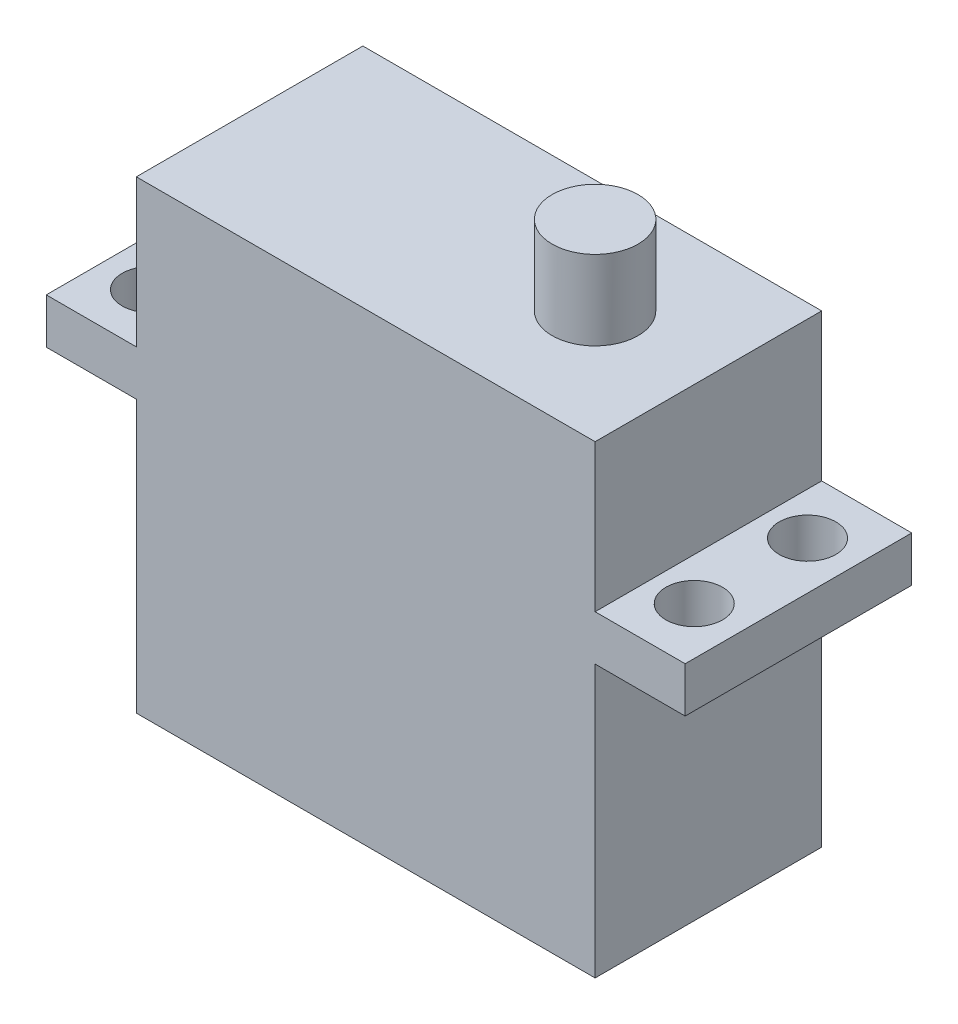
ISO-10303-21;
HEADER;
FILE_DESCRIPTION(('STEP AP214'),'2;1');
FILE_NAME('part.step','',(''),(''),'','','');
FILE_SCHEMA(('AUTOMOTIVE_DESIGN { 1 0 10303 214 1 1 1 1 }'));
ENDSEC;
DATA;
#1=APPLICATION_CONTEXT('core data for automotive mechanical design processes');
#2=APPLICATION_PROTOCOL_DEFINITION('international standard','automotive_design',2000,#1);
#3=PRODUCT_CONTEXT('',#1,'mechanical');
#4=PRODUCT('Part','Part','',(#3));
#5=PRODUCT_RELATED_PRODUCT_CATEGORY('part','',(#4));
#6=PRODUCT_DEFINITION_FORMATION('','',#4);
#7=PRODUCT_DEFINITION_CONTEXT('part definition',#1,'design');
#8=PRODUCT_DEFINITION('design','',#6,#7);
#9=PRODUCT_DEFINITION_SHAPE('','',#8);
#10=(LENGTH_UNIT() NAMED_UNIT(*) SI_UNIT(.MILLI.,.METRE.));
#11=(NAMED_UNIT(*) PLANE_ANGLE_UNIT() SI_UNIT($,.RADIAN.));
#12=(NAMED_UNIT(*) SI_UNIT($,.STERADIAN.) SOLID_ANGLE_UNIT());
#13=UNCERTAINTY_MEASURE_WITH_UNIT(LENGTH_MEASURE(1.E-05),#10,'distance_accuracy_value','');
#14=(GEOMETRIC_REPRESENTATION_CONTEXT(3) GLOBAL_UNCERTAINTY_ASSIGNED_CONTEXT((#13)) GLOBAL_UNIT_ASSIGNED_CONTEXT((#10,
#11,#12)) REPRESENTATION_CONTEXT('',''));
#15=CARTESIAN_POINT('',(0.,0.,0.));
#16=DIRECTION('',(0.,0.,1.));
#17=DIRECTION('',(1.,0.,0.));
#18=AXIS2_PLACEMENT_3D('',#15,#16,#17);
#19=CARTESIAN_POINT('',(-20.25,20.5,20.));
#20=DIRECTION('',(1.,0.,0.));
#21=DIRECTION('',(0.,0.,-1.));
#22=AXIS2_PLACEMENT_3D('',#19,#20,#21);
#23=PLANE('',#22);
#24=DIRECTION('',(0.,0.,-1.));
#25=VECTOR('',#24,1.);
#26=CARTESIAN_POINT('',(-20.25,7.5,0.));
#27=LINE('',#26,#25);
#28=CARTESIAN_POINT('',(-20.25,7.5,20.));
#29=VERTEX_POINT('',#28);
#30=CARTESIAN_POINT('',(-20.25,7.5,0.));
#31=VERTEX_POINT('',#30);
#32=EDGE_CURVE('E61',#29,#31,#27,.T.);
#33=ORIENTED_EDGE('',*,*,#32,.F.);
#34=DIRECTION('',(0.,-1.,0.));
#35=VECTOR('',#34,1.);
#36=CARTESIAN_POINT('',(-20.25,20.5,20.));
#37=LINE('',#36,#35);
#38=CARTESIAN_POINT('',(-20.25,20.5,20.));
#39=VERTEX_POINT('',#38);
#40=EDGE_CURVE('E216',#39,#29,#37,.T.);
#41=ORIENTED_EDGE('',*,*,#40,.F.);
#42=DIRECTION('',(0.,0.,-1.));
#43=VECTOR('',#42,1.);
#44=CARTESIAN_POINT('',(-20.25,20.5,20.));
#45=LINE('',#44,#43);
#46=CARTESIAN_POINT('',(-20.25,20.5,0.));
#47=VERTEX_POINT('',#46);
#48=EDGE_CURVE('E242',#39,#47,#45,.T.);
#49=ORIENTED_EDGE('',*,*,#48,.T.);
#50=DIRECTION('',(0.,-1.,0.));
#51=VECTOR('',#50,1.);
#52=CARTESIAN_POINT('',(-20.25,20.5,0.));
#53=LINE('',#52,#51);
#54=EDGE_CURVE('E229',#47,#31,#53,.T.);
#55=ORIENTED_EDGE('',*,*,#54,.T.);
#56=EDGE_LOOP('',(#33,#41,#49,#55));
#57=FACE_BOUND('',#56,.T.);
#58=ADVANCED_FACE('F45',(#57),#23,.F.);
#59=DIRECTION('',(0.,0.,1.));
#60=VECTOR('',#59,1.);
#61=CARTESIAN_POINT('',(-20.25,3.5,0.));
#62=LINE('',#61,#60);
#63=CARTESIAN_POINT('',(-20.25,3.5,0.));
#64=VERTEX_POINT('',#63);
#65=CARTESIAN_POINT('',(-20.25,3.5,20.));
#66=VERTEX_POINT('',#65);
#67=EDGE_CURVE('E69',#64,#66,#62,.T.);
#68=ORIENTED_EDGE('',*,*,#67,.F.);
#69=CARTESIAN_POINT('',(-20.25,-20.5,0.));
#70=VERTEX_POINT('',#69);
#71=EDGE_CURVE('E161',#64,#70,#53,.T.);
#72=ORIENTED_EDGE('',*,*,#71,.T.);
#73=DIRECTION('',(0.,0.,-1.));
#74=VECTOR('',#73,1.);
#75=CARTESIAN_POINT('',(-20.25,-20.5,20.));
#76=LINE('',#75,#74);
#77=CARTESIAN_POINT('',(-20.25,-20.5,20.));
#78=VERTEX_POINT('',#77);
#79=EDGE_CURVE('E238',#78,#70,#76,.T.);
#80=ORIENTED_EDGE('',*,*,#79,.F.);
#81=EDGE_CURVE('E215',#66,#78,#37,.T.);
#82=ORIENTED_EDGE('',*,*,#81,.F.);
#83=EDGE_LOOP('',(#68,#72,#80,#82));
#84=FACE_BOUND('',#83,.T.);
#85=ADVANCED_FACE('F335',(#84),#23,.F.);
#86=CARTESIAN_POINT('',(20.25,20.5,20.));
#87=DIRECTION('',(-1.,0.,0.));
#88=DIRECTION('',(0.,0.,1.));
#89=AXIS2_PLACEMENT_3D('',#86,#87,#88);
#90=PLANE('',#89);
#91=DIRECTION('',(0.,0.,1.));
#92=VECTOR('',#91,1.);
#93=CARTESIAN_POINT('',(20.25,7.5,20.));
#94=LINE('',#93,#92);
#95=CARTESIAN_POINT('',(20.25,7.5,0.));
#96=VERTEX_POINT('',#95);
#97=CARTESIAN_POINT('',(20.25,7.5,20.));
#98=VERTEX_POINT('',#97);
#99=EDGE_CURVE('E168',#96,#98,#94,.T.);
#100=ORIENTED_EDGE('',*,*,#99,.F.);
#101=DIRECTION('',(0.,1.,0.));
#102=VECTOR('',#101,1.);
#103=CARTESIAN_POINT('',(20.25,20.5,0.));
#104=LINE('',#103,#102);
#105=CARTESIAN_POINT('',(20.25,20.5,0.));
#106=VERTEX_POINT('',#105);
#107=EDGE_CURVE('E206',#96,#106,#104,.T.);
#108=ORIENTED_EDGE('',*,*,#107,.T.);
#109=DIRECTION('',(0.,0.,-1.));
#110=VECTOR('',#109,1.);
#111=CARTESIAN_POINT('',(20.25,20.5,20.));
#112=LINE('',#111,#110);
#113=CARTESIAN_POINT('',(20.25,20.5,20.));
#114=VERTEX_POINT('',#113);
#115=EDGE_CURVE('E54',#114,#106,#112,.T.);
#116=ORIENTED_EDGE('',*,*,#115,.F.);
#117=DIRECTION('',(0.,1.,0.));
#118=VECTOR('',#117,1.);
#119=CARTESIAN_POINT('',(20.25,20.5,20.));
#120=LINE('',#119,#118);
#121=EDGE_CURVE('E212',#98,#114,#120,.T.);
#122=ORIENTED_EDGE('',*,*,#121,.F.);
#123=EDGE_LOOP('',(#100,#108,#116,#122));
#124=FACE_BOUND('',#123,.T.);
#125=ADVANCED_FACE('F47',(#124),#90,.F.);
#126=DIRECTION('',(0.,0.,-1.));
#127=VECTOR('',#126,1.);
#128=CARTESIAN_POINT('',(20.25,3.5,20.));
#129=LINE('',#128,#127);
#130=CARTESIAN_POINT('',(20.25,3.5,20.));
#131=VERTEX_POINT('',#130);
#132=CARTESIAN_POINT('',(20.25,3.5,0.));
#133=VERTEX_POINT('',#132);
#134=EDGE_CURVE('E163',#131,#133,#129,.T.);
#135=ORIENTED_EDGE('',*,*,#134,.F.);
#136=CARTESIAN_POINT('',(20.25,-20.5,20.));
#137=VERTEX_POINT('',#136);
#138=EDGE_CURVE('E207',#137,#131,#120,.T.);
#139=ORIENTED_EDGE('',*,*,#138,.F.);
#140=DIRECTION('',(0.,0.,-1.));
#141=VECTOR('',#140,1.);
#142=CARTESIAN_POINT('',(20.25,-20.5,20.));
#143=LINE('',#142,#141);
#144=CARTESIAN_POINT('',(20.25,-20.5,0.));
#145=VERTEX_POINT('',#144);
#146=EDGE_CURVE('E222',#137,#145,#143,.T.);
#147=ORIENTED_EDGE('',*,*,#146,.T.);
#148=EDGE_CURVE('E223',#145,#133,#104,.T.);
#149=ORIENTED_EDGE('',*,*,#148,.T.);
#150=EDGE_LOOP('',(#135,#139,#147,#149));
#151=FACE_BOUND('',#150,.T.);
#152=ADVANCED_FACE('F323',(#151),#90,.F.);
#153=CARTESIAN_POINT('',(-20.25,20.5,20.));
#154=DIRECTION('',(0.,-1.,0.));
#155=DIRECTION('',(0.,0.,-1.));
#156=AXIS2_PLACEMENT_3D('',#153,#154,#155);
#157=PLANE('',#156);
#158=CARTESIAN_POINT('',(10.25,20.5,10.));
#159=DIRECTION('',(0.,-1.,0.));
#160=DIRECTION('',(0.,0.,-1.));
#161=AXIS2_PLACEMENT_3D('',#158,#159,#160);
#162=CIRCLE('',#161,3.79250970705159);
#163=CARTESIAN_POINT('',(10.25,20.5,6.20749029294841));
#164=VERTEX_POINT('',#163);
#165=EDGE_CURVE('E11',#164,#164,#162,.F.);
#166=ORIENTED_EDGE('',*,*,#165,.F.);
#167=EDGE_LOOP('',(#166));
#168=FACE_BOUND('',#167,.T.);
#169=DIRECTION('',(-1.,0.,0.));
#170=VECTOR('',#169,1.);
#171=CARTESIAN_POINT('',(-20.25,20.5,0.));
#172=LINE('',#171,#170);
#173=EDGE_CURVE('E226',#106,#47,#172,.T.);
#174=ORIENTED_EDGE('',*,*,#173,.T.);
#175=ORIENTED_EDGE('',*,*,#48,.F.);
#176=DIRECTION('',(-1.,0.,0.));
#177=VECTOR('',#176,1.);
#178=CARTESIAN_POINT('',(-20.25,20.5,20.));
#179=LINE('',#178,#177);
#180=EDGE_CURVE('E211',#114,#39,#179,.T.);
#181=ORIENTED_EDGE('',*,*,#180,.F.);
#182=ORIENTED_EDGE('',*,*,#115,.T.);
#183=EDGE_LOOP('',(#174,#175,#181,#182));
#184=FACE_BOUND('',#183,.T.);
#185=ADVANCED_FACE('F250',(#168,#184),#157,.F.);
#186=CARTESIAN_POINT('',(-20.25,-20.5,20.));
#187=DIRECTION('',(0.,1.,0.));
#188=DIRECTION('',(0.,0.,1.));
#189=AXIS2_PLACEMENT_3D('',#186,#187,#188);
#190=PLANE('',#189);
#191=DIRECTION('',(1.,0.,0.));
#192=VECTOR('',#191,1.);
#193=CARTESIAN_POINT('',(-20.25,-20.5,0.));
#194=LINE('',#193,#192);
#195=EDGE_CURVE('E232',#70,#145,#194,.T.);
#196=ORIENTED_EDGE('',*,*,#195,.T.);
#197=ORIENTED_EDGE('',*,*,#146,.F.);
#198=DIRECTION('',(1.,0.,0.));
#199=VECTOR('',#198,1.);
#200=CARTESIAN_POINT('',(-20.25,-20.5,20.));
#201=LINE('',#200,#199);
#202=EDGE_CURVE('E219',#78,#137,#201,.T.);
#203=ORIENTED_EDGE('',*,*,#202,.F.);
#204=ORIENTED_EDGE('',*,*,#79,.T.);
#205=EDGE_LOOP('',(#196,#197,#203,#204));
#206=FACE_BOUND('',#205,.T.);
#207=ADVANCED_FACE('F322',(#206),#190,.F.);
#208=CARTESIAN_POINT('',(0.,0.,20.));
#209=DIRECTION('',(0.,0.,1.));
#210=DIRECTION('',(1.,0.,0.));
#211=AXIS2_PLACEMENT_3D('',#208,#209,#210);
#212=PLANE('',#211);
#213=ORIENTED_EDGE('',*,*,#138,.T.);
#214=DIRECTION('',(-1.,0.,0.));
#215=VECTOR('',#214,1.);
#216=CARTESIAN_POINT('',(28.2,3.5,20.));
#217=LINE('',#216,#215);
#218=CARTESIAN_POINT('',(28.2,3.5,20.));
#219=VERTEX_POINT('',#218);
#220=EDGE_CURVE('E202',#219,#131,#217,.T.);
#221=ORIENTED_EDGE('',*,*,#220,.F.);
#222=DIRECTION('',(0.,-1.,0.));
#223=VECTOR('',#222,1.);
#224=CARTESIAN_POINT('',(28.2,7.5,20.));
#225=LINE('',#224,#223);
#226=CARTESIAN_POINT('',(28.2,7.5,20.));
#227=VERTEX_POINT('',#226);
#228=EDGE_CURVE('E174',#227,#219,#225,.T.);
#229=ORIENTED_EDGE('',*,*,#228,.F.);
#230=DIRECTION('',(-1.,0.,0.));
#231=VECTOR('',#230,1.);
#232=CARTESIAN_POINT('',(28.2,7.5,20.));
#233=LINE('',#232,#231);
#234=EDGE_CURVE('E186',#227,#98,#233,.T.);
#235=ORIENTED_EDGE('',*,*,#234,.T.);
#236=ORIENTED_EDGE('',*,*,#121,.T.);
#237=ORIENTED_EDGE('',*,*,#180,.T.);
#238=ORIENTED_EDGE('',*,*,#40,.T.);
#239=DIRECTION('',(1.,0.,0.));
#240=VECTOR('',#239,1.);
#241=CARTESIAN_POINT('',(-28.2,7.5,20.));
#242=LINE('',#241,#240);
#243=CARTESIAN_POINT('',(-28.2,7.5,20.));
#244=VERTEX_POINT('',#243);
#245=EDGE_CURVE('E170',#244,#29,#242,.T.);
#246=ORIENTED_EDGE('',*,*,#245,.F.);
#247=DIRECTION('',(0.,1.,0.));
#248=VECTOR('',#247,1.);
#249=CARTESIAN_POINT('',(-28.2,7.5,20.));
#250=LINE('',#249,#248);
#251=CARTESIAN_POINT('',(-28.2,3.5,20.));
#252=VERTEX_POINT('',#251);
#253=EDGE_CURVE('E146',#252,#244,#250,.T.);
#254=ORIENTED_EDGE('',*,*,#253,.F.);
#255=DIRECTION('',(1.,0.,0.));
#256=VECTOR('',#255,1.);
#257=CARTESIAN_POINT('',(-28.2,3.5,20.));
#258=LINE('',#257,#256);
#259=EDGE_CURVE('E142',#252,#66,#258,.T.);
#260=ORIENTED_EDGE('',*,*,#259,.T.);
#261=ORIENTED_EDGE('',*,*,#81,.T.);
#262=ORIENTED_EDGE('',*,*,#202,.T.);
#263=EDGE_LOOP('',(#213,#221,#229,#235,#236,#237,#238,#246,#254,#260,#261,#262));
#264=FACE_BOUND('',#263,.T.);
#265=ADVANCED_FACE('F328',(#264),#212,.T.);
#266=CARTESIAN_POINT('',(0.,0.,0.));
#267=DIRECTION('',(0.,0.,1.));
#268=DIRECTION('',(1.,0.,0.));
#269=AXIS2_PLACEMENT_3D('',#266,#267,#268);
#270=PLANE('',#269);
#271=ORIENTED_EDGE('',*,*,#148,.F.);
#272=ORIENTED_EDGE('',*,*,#195,.F.);
#273=ORIENTED_EDGE('',*,*,#71,.F.);
#274=DIRECTION('',(1.,0.,0.));
#275=VECTOR('',#274,1.);
#276=CARTESIAN_POINT('',(-28.2,3.5,0.));
#277=LINE('',#276,#275);
#278=CARTESIAN_POINT('',(-28.2,3.5,0.));
#279=VERTEX_POINT('',#278);
#280=EDGE_CURVE('E140',#279,#64,#277,.T.);
#281=ORIENTED_EDGE('',*,*,#280,.F.);
#282=DIRECTION('',(0.,-1.,0.));
#283=VECTOR('',#282,1.);
#284=CARTESIAN_POINT('',(-28.2,7.5,0.));
#285=LINE('',#284,#283);
#286=CARTESIAN_POINT('',(-28.2,7.5,0.));
#287=VERTEX_POINT('',#286);
#288=EDGE_CURVE('E147',#287,#279,#285,.T.);
#289=ORIENTED_EDGE('',*,*,#288,.F.);
#290=DIRECTION('',(1.,0.,0.));
#291=VECTOR('',#290,1.);
#292=CARTESIAN_POINT('',(-28.2,7.5,0.));
#293=LINE('',#292,#291);
#294=EDGE_CURVE('E258',#287,#31,#293,.T.);
#295=ORIENTED_EDGE('',*,*,#294,.T.);
#296=ORIENTED_EDGE('',*,*,#54,.F.);
#297=ORIENTED_EDGE('',*,*,#173,.F.);
#298=ORIENTED_EDGE('',*,*,#107,.F.);
#299=DIRECTION('',(-1.,0.,0.));
#300=VECTOR('',#299,1.);
#301=CARTESIAN_POINT('',(28.2,7.5,0.));
#302=LINE('',#301,#300);
#303=CARTESIAN_POINT('',(28.2,7.5,0.));
#304=VERTEX_POINT('',#303);
#305=EDGE_CURVE('E194',#304,#96,#302,.T.);
#306=ORIENTED_EDGE('',*,*,#305,.F.);
#307=DIRECTION('',(0.,1.,0.));
#308=VECTOR('',#307,1.);
#309=CARTESIAN_POINT('',(28.2,7.5,0.));
#310=LINE('',#309,#308);
#311=CARTESIAN_POINT('',(28.2,3.5,0.));
#312=VERTEX_POINT('',#311);
#313=EDGE_CURVE('E181',#312,#304,#310,.T.);
#314=ORIENTED_EDGE('',*,*,#313,.F.);
#315=DIRECTION('',(-1.,0.,0.));
#316=VECTOR('',#315,1.);
#317=CARTESIAN_POINT('',(28.2,3.5,0.));
#318=LINE('',#317,#316);
#319=EDGE_CURVE('E198',#312,#133,#318,.T.);
#320=ORIENTED_EDGE('',*,*,#319,.T.);
#321=EDGE_LOOP('',(#271,#272,#273,#281,#289,#295,#296,#297,#298,#306,#314,#320));
#322=FACE_BOUND('',#321,.T.);
#323=ADVANCED_FACE('F159',(#322),#270,.F.);
#324=CARTESIAN_POINT('',(28.2,3.5,20.));
#325=DIRECTION('',(0.,1.,0.));
#326=DIRECTION('',(0.,0.,1.));
#327=AXIS2_PLACEMENT_3D('',#324,#325,#326);
#328=PLANE('',#327);
#329=CARTESIAN_POINT('',(24.,3.5,15.));
#330=DIRECTION('',(0.,1.,0.));
#331=DIRECTION('',(0.,0.,1.));
#332=AXIS2_PLACEMENT_3D('',#329,#330,#331);
#333=CIRCLE('',#332,2.5);
#334=CARTESIAN_POINT('',(24.,3.5,17.5));
#335=VERTEX_POINT('',#334);
#336=EDGE_CURVE('E266',#335,#335,#333,.T.);
#337=ORIENTED_EDGE('',*,*,#336,.T.);
#338=EDGE_LOOP('',(#337));
#339=FACE_BOUND('',#338,.T.);
#340=CARTESIAN_POINT('',(24.,3.5,5.));
#341=DIRECTION('',(0.,1.,0.));
#342=DIRECTION('',(0.,0.,1.));
#343=AXIS2_PLACEMENT_3D('',#340,#341,#342);
#344=CIRCLE('',#343,2.5);
#345=CARTESIAN_POINT('',(24.,3.5,7.5));
#346=VERTEX_POINT('',#345);
#347=EDGE_CURVE('E279',#346,#346,#344,.T.);
#348=ORIENTED_EDGE('',*,*,#347,.T.);
#349=EDGE_LOOP('',(#348));
#350=FACE_BOUND('',#349,.T.);
#351=ORIENTED_EDGE('',*,*,#134,.T.);
#352=ORIENTED_EDGE('',*,*,#319,.F.);
#353=DIRECTION('',(0.,0.,-1.));
#354=VECTOR('',#353,1.);
#355=CARTESIAN_POINT('',(28.2,3.5,20.));
#356=LINE('',#355,#354);
#357=EDGE_CURVE('E178',#219,#312,#356,.T.);
#358=ORIENTED_EDGE('',*,*,#357,.F.);
#359=ORIENTED_EDGE('',*,*,#220,.T.);
#360=EDGE_LOOP('',(#351,#352,#358,#359));
#361=FACE_BOUND('',#360,.T.);
#362=ADVANCED_FACE('F343',(#339,#350,#361),#328,.F.);
#363=CARTESIAN_POINT('',(28.2,7.5,20.));
#364=DIRECTION('',(0.,-1.,0.));
#365=DIRECTION('',(0.,0.,-1.));
#366=AXIS2_PLACEMENT_3D('',#363,#364,#365);
#367=PLANE('',#366);
#368=CARTESIAN_POINT('',(24.,7.5,15.));
#369=DIRECTION('',(0.,1.,0.));
#370=DIRECTION('',(0.,0.,1.));
#371=AXIS2_PLACEMENT_3D('',#368,#369,#370);
#372=CIRCLE('',#371,2.5);
#373=CARTESIAN_POINT('',(24.,7.5,17.5));
#374=VERTEX_POINT('',#373);
#375=EDGE_CURVE('E295',#374,#374,#372,.T.);
#376=ORIENTED_EDGE('',*,*,#375,.F.);
#377=EDGE_LOOP('',(#376));
#378=FACE_BOUND('',#377,.T.);
#379=CARTESIAN_POINT('',(24.,7.5,5.));
#380=DIRECTION('',(0.,1.,0.));
#381=DIRECTION('',(0.,0.,1.));
#382=AXIS2_PLACEMENT_3D('',#379,#380,#381);
#383=CIRCLE('',#382,2.5);
#384=CARTESIAN_POINT('',(24.,7.5,7.5));
#385=VERTEX_POINT('',#384);
#386=EDGE_CURVE('E291',#385,#385,#383,.T.);
#387=ORIENTED_EDGE('',*,*,#386,.F.);
#388=EDGE_LOOP('',(#387));
#389=FACE_BOUND('',#388,.T.);
#390=ORIENTED_EDGE('',*,*,#99,.T.);
#391=ORIENTED_EDGE('',*,*,#234,.F.);
#392=DIRECTION('',(0.,0.,1.));
#393=VECTOR('',#392,1.);
#394=CARTESIAN_POINT('',(28.2,7.5,20.));
#395=LINE('',#394,#393);
#396=EDGE_CURVE('E184',#304,#227,#395,.T.);
#397=ORIENTED_EDGE('',*,*,#396,.F.);
#398=ORIENTED_EDGE('',*,*,#305,.T.);
#399=EDGE_LOOP('',(#390,#391,#397,#398));
#400=FACE_BOUND('',#399,.T.);
#401=ADVANCED_FACE('F349',(#378,#389,#400),#367,.F.);
#402=CARTESIAN_POINT('',(28.2,0.,0.));
#403=DIRECTION('',(1.,0.,0.));
#404=DIRECTION('',(0.,0.,-1.));
#405=AXIS2_PLACEMENT_3D('',#402,#403,#404);
#406=PLANE('',#405);
#407=ORIENTED_EDGE('',*,*,#228,.T.);
#408=ORIENTED_EDGE('',*,*,#357,.T.);
#409=ORIENTED_EDGE('',*,*,#313,.T.);
#410=ORIENTED_EDGE('',*,*,#396,.T.);
#411=EDGE_LOOP('',(#407,#408,#409,#410));
#412=FACE_BOUND('',#411,.T.);
#413=ADVANCED_FACE('F353',(#412),#406,.T.);
#414=CARTESIAN_POINT('',(-28.2,3.5,0.));
#415=DIRECTION('',(0.,1.,0.));
#416=DIRECTION('',(0.,0.,1.));
#417=AXIS2_PLACEMENT_3D('',#414,#415,#416);
#418=PLANE('',#417);
#419=CARTESIAN_POINT('',(-24.,3.5,5.));
#420=DIRECTION('',(0.,1.,0.));
#421=DIRECTION('',(0.,0.,1.));
#422=AXIS2_PLACEMENT_3D('',#419,#420,#421);
#423=CIRCLE('',#422,2.5);
#424=CARTESIAN_POINT('',(-24.,3.5,7.5));
#425=VERTEX_POINT('',#424);
#426=EDGE_CURVE('E283',#425,#425,#423,.T.);
#427=ORIENTED_EDGE('',*,*,#426,.T.);
#428=EDGE_LOOP('',(#427));
#429=FACE_BOUND('',#428,.T.);
#430=CARTESIAN_POINT('',(-24.,3.5,15.));
#431=DIRECTION('',(0.,1.,0.));
#432=DIRECTION('',(0.,0.,1.));
#433=AXIS2_PLACEMENT_3D('',#430,#431,#432);
#434=CIRCLE('',#433,2.5);
#435=CARTESIAN_POINT('',(-24.,3.5,17.5));
#436=VERTEX_POINT('',#435);
#437=EDGE_CURVE('E287',#436,#436,#434,.T.);
#438=ORIENTED_EDGE('',*,*,#437,.T.);
#439=EDGE_LOOP('',(#438));
#440=FACE_BOUND('',#439,.T.);
#441=ORIENTED_EDGE('',*,*,#67,.T.);
#442=ORIENTED_EDGE('',*,*,#259,.F.);
#443=DIRECTION('',(0.,0.,1.));
#444=VECTOR('',#443,1.);
#445=CARTESIAN_POINT('',(-28.2,3.5,0.));
#446=LINE('',#445,#444);
#447=EDGE_CURVE('E136',#279,#252,#446,.T.);
#448=ORIENTED_EDGE('',*,*,#447,.F.);
#449=ORIENTED_EDGE('',*,*,#280,.T.);
#450=EDGE_LOOP('',(#441,#442,#448,#449));
#451=FACE_BOUND('',#450,.T.);
#452=ADVANCED_FACE('F138',(#429,#440,#451),#418,.F.);
#453=CARTESIAN_POINT('',(-28.2,7.5,0.));
#454=DIRECTION('',(0.,-1.,0.));
#455=DIRECTION('',(0.,0.,-1.));
#456=AXIS2_PLACEMENT_3D('',#453,#454,#455);
#457=PLANE('',#456);
#458=CARTESIAN_POINT('',(-24.,7.5,5.));
#459=DIRECTION('',(0.,1.,0.));
#460=DIRECTION('',(0.,0.,1.));
#461=AXIS2_PLACEMENT_3D('',#458,#459,#460);
#462=CIRCLE('',#461,2.5);
#463=CARTESIAN_POINT('',(-24.,7.5,7.5));
#464=VERTEX_POINT('',#463);
#465=EDGE_CURVE('E296',#464,#464,#462,.T.);
#466=ORIENTED_EDGE('',*,*,#465,.F.);
#467=EDGE_LOOP('',(#466));
#468=FACE_BOUND('',#467,.T.);
#469=CARTESIAN_POINT('',(-24.,7.5,15.));
#470=DIRECTION('',(0.,1.,0.));
#471=DIRECTION('',(0.,0.,1.));
#472=AXIS2_PLACEMENT_3D('',#469,#470,#471);
#473=CIRCLE('',#472,2.5);
#474=CARTESIAN_POINT('',(-24.,7.5,17.5));
#475=VERTEX_POINT('',#474);
#476=EDGE_CURVE('E300',#475,#475,#473,.T.);
#477=ORIENTED_EDGE('',*,*,#476,.F.);
#478=EDGE_LOOP('',(#477));
#479=FACE_BOUND('',#478,.T.);
#480=ORIENTED_EDGE('',*,*,#32,.T.);
#481=ORIENTED_EDGE('',*,*,#294,.F.);
#482=DIRECTION('',(0.,0.,-1.));
#483=VECTOR('',#482,1.);
#484=CARTESIAN_POINT('',(-28.2,7.5,0.));
#485=LINE('',#484,#483);
#486=EDGE_CURVE('E152',#244,#287,#485,.T.);
#487=ORIENTED_EDGE('',*,*,#486,.F.);
#488=ORIENTED_EDGE('',*,*,#245,.T.);
#489=EDGE_LOOP('',(#480,#481,#487,#488));
#490=FACE_BOUND('',#489,.T.);
#491=ADVANCED_FACE('F261',(#468,#479,#490),#457,.F.);
#492=CARTESIAN_POINT('',(-28.2,0.,0.));
#493=DIRECTION('',(-1.,0.,0.));
#494=DIRECTION('',(0.,0.,1.));
#495=AXIS2_PLACEMENT_3D('',#492,#493,#494);
#496=PLANE('',#495);
#497=ORIENTED_EDGE('',*,*,#288,.T.);
#498=ORIENTED_EDGE('',*,*,#447,.T.);
#499=ORIENTED_EDGE('',*,*,#253,.T.);
#500=ORIENTED_EDGE('',*,*,#486,.T.);
#501=EDGE_LOOP('',(#497,#498,#499,#500));
#502=FACE_BOUND('',#501,.T.);
#503=ADVANCED_FACE('F150',(#502),#496,.T.);
#504=CARTESIAN_POINT('',(-24.,-20.5,15.));
#505=DIRECTION('',(0.,1.,0.));
#506=DIRECTION('',(0.,0.,1.));
#507=AXIS2_PLACEMENT_3D('',#504,#505,#506);
#508=CYLINDRICAL_SURFACE('',#507,2.5);
#509=ORIENTED_EDGE('',*,*,#476,.T.);
#510=EDGE_LOOP('',(#509));
#511=FACE_BOUND('',#510,.T.);
#512=ORIENTED_EDGE('',*,*,#437,.F.);
#513=EDGE_LOOP('',(#512));
#514=FACE_BOUND('',#513,.T.);
#515=ADVANCED_FACE('F365',(#511,#514),#508,.F.);
#516=CARTESIAN_POINT('',(-24.,-20.5,5.));
#517=DIRECTION('',(0.,1.,0.));
#518=DIRECTION('',(0.,0.,1.));
#519=AXIS2_PLACEMENT_3D('',#516,#517,#518);
#520=CYLINDRICAL_SURFACE('',#519,2.5);
#521=ORIENTED_EDGE('',*,*,#465,.T.);
#522=EDGE_LOOP('',(#521));
#523=FACE_BOUND('',#522,.T.);
#524=ORIENTED_EDGE('',*,*,#426,.F.);
#525=EDGE_LOOP('',(#524));
#526=FACE_BOUND('',#525,.T.);
#527=ADVANCED_FACE('F369',(#523,#526),#520,.F.);
#528=CARTESIAN_POINT('',(24.,-20.5,5.));
#529=DIRECTION('',(0.,1.,0.));
#530=DIRECTION('',(0.,0.,1.));
#531=AXIS2_PLACEMENT_3D('',#528,#529,#530);
#532=CYLINDRICAL_SURFACE('',#531,2.5);
#533=ORIENTED_EDGE('',*,*,#386,.T.);
#534=EDGE_LOOP('',(#533));
#535=FACE_BOUND('',#534,.T.);
#536=ORIENTED_EDGE('',*,*,#347,.F.);
#537=EDGE_LOOP('',(#536));
#538=FACE_BOUND('',#537,.T.);
#539=ADVANCED_FACE('F366',(#535,#538),#532,.F.);
#540=CARTESIAN_POINT('',(24.,-20.5,15.));
#541=DIRECTION('',(0.,1.,0.));
#542=DIRECTION('',(0.,0.,1.));
#543=AXIS2_PLACEMENT_3D('',#540,#541,#542);
#544=CYLINDRICAL_SURFACE('',#543,2.5);
#545=ORIENTED_EDGE('',*,*,#375,.T.);
#546=EDGE_LOOP('',(#545));
#547=FACE_BOUND('',#546,.T.);
#548=ORIENTED_EDGE('',*,*,#336,.F.);
#549=EDGE_LOOP('',(#548));
#550=FACE_BOUND('',#549,.T.);
#551=ADVANCED_FACE('F317',(#547,#550),#544,.F.);
#552=CARTESIAN_POINT('',(10.25,27.5,10.));
#553=DIRECTION('',(0.,-1.,0.));
#554=DIRECTION('',(0.,0.,-1.));
#555=AXIS2_PLACEMENT_3D('',#552,#553,#554);
#556=CYLINDRICAL_SURFACE('',#555,3.79250970705159);
#557=CARTESIAN_POINT('',(10.25,27.5,10.));
#558=DIRECTION('',(0.,1.,0.));
#559=DIRECTION('',(0.,0.,1.));
#560=AXIS2_PLACEMENT_3D('',#557,#558,#559);
#561=CIRCLE('',#560,3.79250970705159);
#562=CARTESIAN_POINT('',(10.25,27.5,13.7925097070516));
#563=VERTEX_POINT('',#562);
#564=EDGE_CURVE('E307',#563,#563,#561,.T.);
#565=ORIENTED_EDGE('',*,*,#564,.F.);
#566=EDGE_LOOP('',(#565));
#567=FACE_BOUND('',#566,.T.);
#568=ORIENTED_EDGE('',*,*,#165,.T.);
#569=EDGE_LOOP('',(#568));
#570=FACE_BOUND('',#569,.T.);
#571=ADVANCED_FACE('F314',(#567,#570),#556,.T.);
#572=CARTESIAN_POINT('',(10.25,27.5,10.));
#573=DIRECTION('',(0.,1.,0.));
#574=DIRECTION('',(0.,0.,1.));
#575=AXIS2_PLACEMENT_3D('',#572,#573,#574);
#576=PLANE('',#575);
#577=ORIENTED_EDGE('',*,*,#564,.T.);
#578=EDGE_LOOP('',(#577));
#579=FACE_BOUND('',#578,.T.);
#580=ADVANCED_FACE('F312',(#579),#576,.T.);
#581=CLOSED_SHELL('',(#58,#85,#125,#152,#185,#207,#265,#323,#362,#401,#413,#452,#491,#503,#515,
#527,#539,#551,#571,#580));
#582=MANIFOLD_SOLID_BREP('B2',#581);
#583=ADVANCED_BREP_SHAPE_REPRESENTATION('',(#18,#582),#14);
#584=SHAPE_DEFINITION_REPRESENTATION(#9,#583);
ENDSEC;
END-ISO-10303-21;
